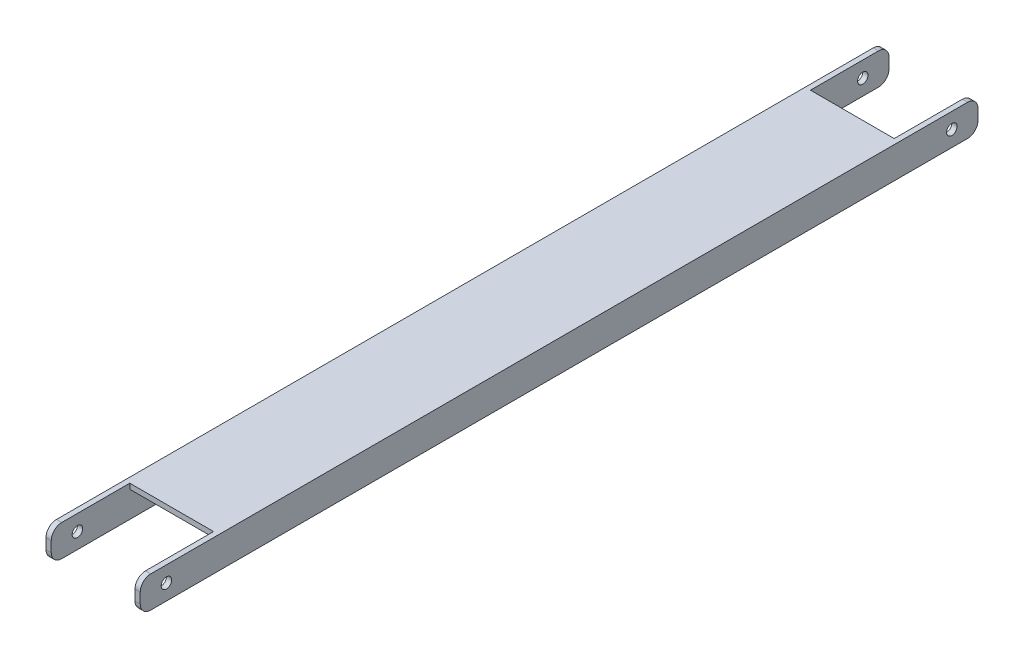
ISO-10303-21;
HEADER;
FILE_DESCRIPTION(('STEP AP214'),'2;1');
FILE_NAME('part.step','',(''),(''),'','','');
FILE_SCHEMA(('AUTOMOTIVE_DESIGN { 1 0 10303 214 1 1 1 1 }'));
ENDSEC;
DATA;
#1=APPLICATION_CONTEXT('core data for automotive mechanical design processes');
#2=APPLICATION_PROTOCOL_DEFINITION('international standard','automotive_design',2000,#1);
#3=PRODUCT_CONTEXT('',#1,'mechanical');
#4=PRODUCT('Part','Part','',(#3));
#5=PRODUCT_RELATED_PRODUCT_CATEGORY('part','',(#4));
#6=PRODUCT_DEFINITION_FORMATION('','',#4);
#7=PRODUCT_DEFINITION_CONTEXT('part definition',#1,'design');
#8=PRODUCT_DEFINITION('design','',#6,#7);
#9=PRODUCT_DEFINITION_SHAPE('','',#8);
#10=(LENGTH_UNIT() NAMED_UNIT(*) SI_UNIT(.MILLI.,.METRE.));
#11=(NAMED_UNIT(*) PLANE_ANGLE_UNIT() SI_UNIT($,.RADIAN.));
#12=(NAMED_UNIT(*) SI_UNIT($,.STERADIAN.) SOLID_ANGLE_UNIT());
#13=UNCERTAINTY_MEASURE_WITH_UNIT(LENGTH_MEASURE(1.E-05),#10,'distance_accuracy_value','');
#14=(GEOMETRIC_REPRESENTATION_CONTEXT(3) GLOBAL_UNCERTAINTY_ASSIGNED_CONTEXT((#13)) GLOBAL_UNIT_ASSIGNED_CONTEXT((#10,
#11,#12)) REPRESENTATION_CONTEXT('',''));
#15=CARTESIAN_POINT('',(0.,0.,0.));
#16=DIRECTION('',(0.,0.,1.));
#17=DIRECTION('',(1.,0.,0.));
#18=AXIS2_PLACEMENT_3D('',#15,#16,#17);
#19=CARTESIAN_POINT('',(-8.99999999999991,0.,154.999999999999));
#20=DIRECTION('',(1.,0.,0.));
#21=DIRECTION('',(0.,0.,-1.));
#22=AXIS2_PLACEMENT_3D('',#19,#20,#21);
#23=CYLINDRICAL_SURFACE('',#22,1.);
#24=CARTESIAN_POINT('',(-7.99999999999989,0.,154.999999999999));
#25=DIRECTION('',(1.,0.,0.));
#26=DIRECTION('',(0.,0.,-1.));
#27=AXIS2_PLACEMENT_3D('',#24,#25,#26);
#28=CIRCLE('',#27,1.);
#29=CARTESIAN_POINT('',(-7.99999999999989,0.,153.999999999999));
#30=VERTEX_POINT('',#29);
#31=EDGE_CURVE('E304',#30,#30,#28,.T.);
#32=ORIENTED_EDGE('',*,*,#31,.T.);
#33=EDGE_LOOP('',(#32));
#34=FACE_BOUND('',#33,.T.);
#35=CARTESIAN_POINT('',(-8.99999999999991,0.,154.999999999999));
#36=DIRECTION('',(1.,0.,0.));
#37=DIRECTION('',(0.,0.,-1.));
#38=AXIS2_PLACEMENT_3D('',#35,#36,#37);
#39=CIRCLE('',#38,1.);
#40=CARTESIAN_POINT('',(-8.99999999999991,0.,153.999999999999));
#41=VERTEX_POINT('',#40);
#42=EDGE_CURVE('E221',#41,#41,#39,.F.);
#43=ORIENTED_EDGE('',*,*,#42,.T.);
#44=EDGE_LOOP('',(#43));
#45=FACE_BOUND('',#44,.T.);
#46=ADVANCED_FACE('F17',(#34,#45),#23,.F.);
#47=CARTESIAN_POINT('',(-8.99999999999998,-2.77555756156289E-13,4.99999999999998));
#48=DIRECTION('',(1.,0.,0.));
#49=DIRECTION('',(0.,0.,-1.));
#50=AXIS2_PLACEMENT_3D('',#47,#48,#49);
#51=CYLINDRICAL_SURFACE('',#50,0.999999999999992);
#52=CARTESIAN_POINT('',(-7.99999999999997,-2.77541878368481E-13,4.99999999999998));
#53=DIRECTION('',(1.,0.,0.));
#54=DIRECTION('',(0.,0.,-1.));
#55=AXIS2_PLACEMENT_3D('',#52,#53,#54);
#56=CIRCLE('',#55,0.999999999999992);
#57=CARTESIAN_POINT('',(-7.99999999999997,-2.77541878368481E-13,3.99999999999999));
#58=VERTEX_POINT('',#57);
#59=EDGE_CURVE('E301',#58,#58,#56,.T.);
#60=ORIENTED_EDGE('',*,*,#59,.T.);
#61=EDGE_LOOP('',(#60));
#62=FACE_BOUND('',#61,.T.);
#63=CARTESIAN_POINT('',(-8.99999999999998,-2.77555756156289E-13,4.99999999999998));
#64=DIRECTION('',(1.,0.,0.));
#65=DIRECTION('',(0.,0.,-1.));
#66=AXIS2_PLACEMENT_3D('',#63,#64,#65);
#67=CIRCLE('',#66,0.999999999999992);
#68=CARTESIAN_POINT('',(-8.99999999999998,-2.77555756156289E-13,3.99999999999999));
#69=VERTEX_POINT('',#68);
#70=EDGE_CURVE('E164',#69,#69,#67,.F.);
#71=ORIENTED_EDGE('',*,*,#70,.T.);
#72=EDGE_LOOP('',(#71));
#73=FACE_BOUND('',#72,.T.);
#74=ADVANCED_FACE('F626',(#62,#73),#51,.F.);
#75=CARTESIAN_POINT('',(-9.,-1.,2.));
#76=DIRECTION('',(1.,0.,0.));
#77=DIRECTION('',(0.,0.,-1.));
#78=AXIS2_PLACEMENT_3D('',#75,#76,#77);
#79=CYLINDRICAL_SURFACE('',#78,1.99999999999999);
#80=CARTESIAN_POINT('',(-8.,-1.,2.));
#81=DIRECTION('',(1.,0.,0.));
#82=DIRECTION('',(0.,0.,-1.));
#83=AXIS2_PLACEMENT_3D('',#80,#81,#82);
#84=CIRCLE('',#83,1.99999999999999);
#85=CARTESIAN_POINT('',(-8.,-1.,0.));
#86=VERTEX_POINT('',#85);
#87=CARTESIAN_POINT('',(-8.,-3.00000000000012,2.));
#88=VERTEX_POINT('',#87);
#89=EDGE_CURVE('E298',#86,#88,#84,.F.);
#90=ORIENTED_EDGE('',*,*,#89,.T.);
#91=DIRECTION('',(1.,0.,0.));
#92=VECTOR('',#91,1.);
#93=CARTESIAN_POINT('',(-8.99999999999994,-3.00000000000011,2.));
#94=LINE('',#93,#92);
#95=CARTESIAN_POINT('',(-8.99999999999999,-3.00000000000004,2.));
#96=VERTEX_POINT('',#95);
#97=EDGE_CURVE('E251',#88,#96,#94,.F.);
#98=ORIENTED_EDGE('',*,*,#97,.T.);
#99=CARTESIAN_POINT('',(-8.99999999999999,-1.,2.));
#100=DIRECTION('',(1.,0.,0.));
#101=DIRECTION('',(0.,0.,-1.));
#102=AXIS2_PLACEMENT_3D('',#99,#100,#101);
#103=CIRCLE('',#102,1.99999999999999);
#104=CARTESIAN_POINT('',(-8.99999999999998,-1.,0.));
#105=VERTEX_POINT('',#104);
#106=EDGE_CURVE('E311',#96,#105,#103,.T.);
#107=ORIENTED_EDGE('',*,*,#106,.T.);
#108=DIRECTION('',(1.,0.,0.));
#109=VECTOR('',#108,1.);
#110=CARTESIAN_POINT('',(0.,-1.00000000000001,0.));
#111=LINE('',#110,#109);
#112=EDGE_CURVE('E243',#105,#86,#111,.T.);
#113=ORIENTED_EDGE('',*,*,#112,.T.);
#114=EDGE_LOOP('',(#90,#98,#107,#113));
#115=FACE_BOUND('',#114,.T.);
#116=ADVANCED_FACE('F379',(#115),#79,.T.);
#117=CARTESIAN_POINT('',(-8.99999999999994,-3.00000000000009,159.999999999999));
#118=DIRECTION('',(0.,1.,0.));
#119=DIRECTION('',(0.,0.,1.));
#120=AXIS2_PLACEMENT_3D('',#117,#118,#119);
#121=PLANE('',#120);
#122=ORIENTED_EDGE('',*,*,#97,.F.);
#123=DIRECTION('',(0.,0.,1.));
#124=VECTOR('',#123,1.);
#125=CARTESIAN_POINT('',(-7.99999999999999,-3.00000000000013,159.999999999999));
#126=LINE('',#125,#124);
#127=CARTESIAN_POINT('',(-7.99999999999995,-3.00000000000014,157.999999999999));
#128=VERTEX_POINT('',#127);
#129=EDGE_CURVE('E297',#88,#128,#126,.T.);
#130=ORIENTED_EDGE('',*,*,#129,.T.);
#131=DIRECTION('',(-1.,0.,0.));
#132=VECTOR('',#131,1.);
#133=CARTESIAN_POINT('',(0.,-3.00000000000015,157.999999999999));
#134=LINE('',#133,#132);
#135=CARTESIAN_POINT('',(-8.99999999999997,-3.00000000000005,157.999999999999));
#136=VERTEX_POINT('',#135);
#137=EDGE_CURVE('E146',#136,#128,#134,.F.);
#138=ORIENTED_EDGE('',*,*,#137,.F.);
#139=DIRECTION('',(0.,0.,-1.));
#140=VECTOR('',#139,1.);
#141=CARTESIAN_POINT('',(-8.99999999999994,-2.99999999999996,159.999999999999));
#142=LINE('',#141,#140);
#143=EDGE_CURVE('E158',#136,#96,#142,.T.);
#144=ORIENTED_EDGE('',*,*,#143,.T.);
#145=EDGE_LOOP('',(#122,#130,#138,#144));
#146=FACE_BOUND('',#145,.T.);
#147=ADVANCED_FACE('F382',(#146),#121,.F.);
#148=CARTESIAN_POINT('',(0.,-1.00000000000017,157.999999999999));
#149=DIRECTION('',(-1.,0.,0.));
#150=DIRECTION('',(0.,0.,1.));
#151=AXIS2_PLACEMENT_3D('',#148,#149,#150);
#152=CYLINDRICAL_SURFACE('',#151,1.99999999999997);
#153=CARTESIAN_POINT('',(-7.99999999999992,-1.00000000000017,157.999999999999));
#154=DIRECTION('',(-1.,0.,0.));
#155=DIRECTION('',(0.,0.,1.));
#156=AXIS2_PLACEMENT_3D('',#153,#154,#155);
#157=CIRCLE('',#156,1.99999999999997);
#158=CARTESIAN_POINT('',(-7.99999999999995,-1.00000000000008,159.999999999999));
#159=VERTEX_POINT('',#158);
#160=EDGE_CURVE('E140',#128,#159,#157,.T.);
#161=ORIENTED_EDGE('',*,*,#160,.T.);
#162=DIRECTION('',(1.,0.,0.));
#163=VECTOR('',#162,1.);
#164=CARTESIAN_POINT('',(0.,-0.99999999999998,159.999999999999));
#165=LINE('',#164,#163);
#166=CARTESIAN_POINT('',(-8.99999999999997,-1.00000000000008,159.999999999999));
#167=VERTEX_POINT('',#166);
#168=EDGE_CURVE('E20',#167,#159,#165,.T.);
#169=ORIENTED_EDGE('',*,*,#168,.F.);
#170=CARTESIAN_POINT('',(-8.99999999999997,-1.00000000000017,157.999999999999));
#171=DIRECTION('',(-1.,0.,0.));
#172=DIRECTION('',(0.,0.,1.));
#173=AXIS2_PLACEMENT_3D('',#170,#171,#172);
#174=CIRCLE('',#173,1.99999999999997);
#175=EDGE_CURVE('E138',#167,#136,#174,.F.);
#176=ORIENTED_EDGE('',*,*,#175,.T.);
#177=ORIENTED_EDGE('',*,*,#137,.T.);
#178=EDGE_LOOP('',(#161,#169,#176,#177));
#179=FACE_BOUND('',#178,.T.);
#180=ADVANCED_FACE('F137',(#179),#152,.T.);
#181=CARTESIAN_POINT('',(0.,-1.94289029309402E-13,159.999999999999));
#182=DIRECTION('',(0.,0.,1.));
#183=DIRECTION('',(1.,0.,0.));
#184=AXIS2_PLACEMENT_3D('',#181,#182,#183);
#185=PLANE('',#184);
#186=DIRECTION('',(0.,1.,0.));
#187=VECTOR('',#186,1.);
#188=CARTESIAN_POINT('',(-7.99999999999999,-3.00000000000017,159.999999999999));
#189=LINE('',#188,#187);
#190=CARTESIAN_POINT('',(-8.00000000000001,0.999999999999924,159.999999999999));
#191=VERTEX_POINT('',#190);
#192=EDGE_CURVE('E295',#159,#191,#189,.T.);
#193=ORIENTED_EDGE('',*,*,#192,.T.);
#194=DIRECTION('',(1.,0.,0.));
#195=VECTOR('',#194,1.);
#196=CARTESIAN_POINT('',(0.,0.999999999999919,159.999999999999));
#197=LINE('',#196,#195);
#198=CARTESIAN_POINT('',(-8.99999999999989,0.999999999999924,159.999999999999));
#199=VERTEX_POINT('',#198);
#200=EDGE_CURVE('E161',#199,#191,#197,.T.);
#201=ORIENTED_EDGE('',*,*,#200,.F.);
#202=DIRECTION('',(0.,1.,0.));
#203=VECTOR('',#202,1.);
#204=CARTESIAN_POINT('',(-8.99999999999994,-3.00000000000009,159.999999999999));
#205=LINE('',#204,#203);
#206=EDGE_CURVE('E154',#199,#167,#205,.F.);
#207=ORIENTED_EDGE('',*,*,#206,.T.);
#208=ORIENTED_EDGE('',*,*,#168,.T.);
#209=EDGE_LOOP('',(#193,#201,#207,#208));
#210=FACE_BOUND('',#209,.T.);
#211=ADVANCED_FACE('F160',(#210),#185,.T.);
#212=CARTESIAN_POINT('',(0.,0.999999999999931,157.999999999999));
#213=DIRECTION('',(1.,0.,0.));
#214=DIRECTION('',(0.,0.,-1.));
#215=AXIS2_PLACEMENT_3D('',#212,#213,#214);
#216=CYLINDRICAL_SURFACE('',#215,2.);
#217=CARTESIAN_POINT('',(-8.99999999999989,0.99999999999993,157.999999999999));
#218=DIRECTION('',(1.,0.,0.));
#219=DIRECTION('',(0.,0.,-1.));
#220=AXIS2_PLACEMENT_3D('',#217,#218,#219);
#221=CIRCLE('',#220,2.);
#222=CARTESIAN_POINT('',(-8.99999999999989,2.99999999999989,157.999999999999));
#223=VERTEX_POINT('',#222);
#224=EDGE_CURVE('E162',#223,#199,#221,.T.);
#225=ORIENTED_EDGE('',*,*,#224,.T.);
#226=ORIENTED_EDGE('',*,*,#200,.T.);
#227=CARTESIAN_POINT('',(-8.00000000000001,0.99999999999993,157.999999999999));
#228=DIRECTION('',(1.,0.,0.));
#229=DIRECTION('',(0.,0.,-1.));
#230=AXIS2_PLACEMENT_3D('',#227,#228,#229);
#231=CIRCLE('',#230,2.);
#232=CARTESIAN_POINT('',(-8.00000000000001,2.99999999999989,157.999999999999));
#233=VERTEX_POINT('',#232);
#234=EDGE_CURVE('E183',#191,#233,#231,.F.);
#235=ORIENTED_EDGE('',*,*,#234,.T.);
#236=DIRECTION('',(1.,0.,0.));
#237=VECTOR('',#236,1.);
#238=CARTESIAN_POINT('',(0.,2.99999999999993,157.999999999999));
#239=LINE('',#238,#237);
#240=EDGE_CURVE('E145',#233,#223,#239,.F.);
#241=ORIENTED_EDGE('',*,*,#240,.T.);
#242=EDGE_LOOP('',(#225,#226,#235,#241));
#243=FACE_BOUND('',#242,.T.);
#244=ADVANCED_FACE('F391',(#243),#216,.T.);
#245=CARTESIAN_POINT('',(8.99999999999999,1.,2.00000000000001));
#246=DIRECTION('',(-1.,0.,0.));
#247=DIRECTION('',(0.,0.,1.));
#248=AXIS2_PLACEMENT_3D('',#245,#246,#247);
#249=CYLINDRICAL_SURFACE('',#248,2.);
#250=CARTESIAN_POINT('',(-8.99999999999997,0.999999999999998,2.));
#251=DIRECTION('',(-1.,0.,0.));
#252=DIRECTION('',(0.,0.,1.));
#253=AXIS2_PLACEMENT_3D('',#250,#251,#252);
#254=CIRCLE('',#253,2.);
#255=CARTESIAN_POINT('',(-8.99999999999996,0.999999999999861,0.));
#256=VERTEX_POINT('',#255);
#257=CARTESIAN_POINT('',(-8.99999999999997,2.99999999999993,2.));
#258=VERTEX_POINT('',#257);
#259=EDGE_CURVE('E307',#256,#258,#254,.F.);
#260=ORIENTED_EDGE('',*,*,#259,.T.);
#261=DIRECTION('',(-1.,0.,0.));
#262=VECTOR('',#261,1.);
#263=CARTESIAN_POINT('',(8.99999999999999,3.,2.00000000000001));
#264=LINE('',#263,#262);
#265=CARTESIAN_POINT('',(-8.,2.99999999999993,2.));
#266=VERTEX_POINT('',#265);
#267=EDGE_CURVE('E246',#258,#266,#264,.F.);
#268=ORIENTED_EDGE('',*,*,#267,.T.);
#269=CARTESIAN_POINT('',(-8.,0.999999999999998,2.));
#270=DIRECTION('',(-1.,0.,0.));
#271=DIRECTION('',(0.,0.,1.));
#272=AXIS2_PLACEMENT_3D('',#269,#270,#271);
#273=CIRCLE('',#272,2.);
#274=CARTESIAN_POINT('',(-8.,0.999999999999861,0.));
#275=VERTEX_POINT('',#274);
#276=EDGE_CURVE('E238',#266,#275,#273,.T.);
#277=ORIENTED_EDGE('',*,*,#276,.T.);
#278=DIRECTION('',(1.,0.,0.));
#279=VECTOR('',#278,1.);
#280=CARTESIAN_POINT('',(0.,0.999999999999723,0.));
#281=LINE('',#280,#279);
#282=EDGE_CURVE('E241',#275,#256,#281,.F.);
#283=ORIENTED_EDGE('',*,*,#282,.T.);
#284=EDGE_LOOP('',(#260,#268,#277,#283));
#285=FACE_BOUND('',#284,.T.);
#286=ADVANCED_FACE('F398',(#285),#249,.T.);
#287=CARTESIAN_POINT('',(0.,0.,0.));
#288=DIRECTION('',(0.,0.,1.));
#289=DIRECTION('',(1.,0.,0.));
#290=AXIS2_PLACEMENT_3D('',#287,#288,#289);
#291=PLANE('',#290);
#292=ORIENTED_EDGE('',*,*,#282,.F.);
#293=DIRECTION('',(0.,1.,0.));
#294=VECTOR('',#293,1.);
#295=CARTESIAN_POINT('',(-8.,-3.00000000000017,0.));
#296=LINE('',#295,#294);
#297=EDGE_CURVE('E233',#275,#86,#296,.F.);
#298=ORIENTED_EDGE('',*,*,#297,.T.);
#299=ORIENTED_EDGE('',*,*,#112,.F.);
#300=DIRECTION('',(0.,1.,0.));
#301=VECTOR('',#300,1.);
#302=CARTESIAN_POINT('',(-8.99999999999996,-3.00000000000009,0.));
#303=LINE('',#302,#301);
#304=EDGE_CURVE('E310',#105,#256,#303,.T.);
#305=ORIENTED_EDGE('',*,*,#304,.T.);
#306=EDGE_LOOP('',(#292,#298,#299,#305));
#307=FACE_BOUND('',#306,.T.);
#308=ADVANCED_FACE('F376',(#307),#291,.F.);
#309=CARTESIAN_POINT('',(7.99999999999994,2.00000000000011,159.999999999999));
#310=DIRECTION('',(0.,1.,0.));
#311=DIRECTION('',(0.,0.,1.));
#312=AXIS2_PLACEMENT_3D('',#309,#310,#311);
#313=PLANE('',#312);
#314=DIRECTION('',(-1.,0.,0.));
#315=VECTOR('',#314,1.);
#316=CARTESIAN_POINT('',(-7.9999999999999,2.00000000000011,144.999999999999));
#317=LINE('',#316,#315);
#318=CARTESIAN_POINT('',(7.99999999999999,2.00000000000003,144.999999999999));
#319=VERTEX_POINT('',#318);
#320=CARTESIAN_POINT('',(-7.99999999999994,2.00000000000004,144.999999999999));
#321=VERTEX_POINT('',#320);
#322=EDGE_CURVE('E205',#319,#321,#317,.T.);
#323=ORIENTED_EDGE('',*,*,#322,.T.);
#324=DIRECTION('',(0.,0.,1.));
#325=VECTOR('',#324,1.);
#326=CARTESIAN_POINT('',(-7.99999999999999,2.,159.999999999999));
#327=LINE('',#326,#325);
#328=CARTESIAN_POINT('',(-7.99999999999995,1.99999999999982,15.));
#329=VERTEX_POINT('',#328);
#330=EDGE_CURVE('E182',#321,#329,#327,.F.);
#331=ORIENTED_EDGE('',*,*,#330,.T.);
#332=DIRECTION('',(1.,0.,0.));
#333=VECTOR('',#332,1.);
#334=CARTESIAN_POINT('',(-7.99999999999999,1.99999999999972,15.));
#335=LINE('',#334,#333);
#336=CARTESIAN_POINT('',(7.99999999999999,1.9999999999999,15.));
#337=VERTEX_POINT('',#336);
#338=EDGE_CURVE('E229',#329,#337,#335,.T.);
#339=ORIENTED_EDGE('',*,*,#338,.T.);
#340=DIRECTION('',(0.,0.,-1.));
#341=VECTOR('',#340,1.);
#342=CARTESIAN_POINT('',(7.99999999999999,1.99999999999999,159.999999999999));
#343=LINE('',#342,#341);
#344=EDGE_CURVE('E200',#337,#319,#343,.F.);
#345=ORIENTED_EDGE('',*,*,#344,.T.);
#346=EDGE_LOOP('',(#323,#331,#339,#345));
#347=FACE_BOUND('',#346,.T.);
#348=ADVANCED_FACE('F424',(#347),#313,.F.);
#349=CARTESIAN_POINT('',(-8.99999999999991,0.,154.999999999999));
#350=DIRECTION('',(1.,0.,0.));
#351=DIRECTION('',(0.,0.,-1.));
#352=AXIS2_PLACEMENT_3D('',#349,#350,#351);
#353=CYLINDRICAL_SURFACE('',#352,1.);
#354=CARTESIAN_POINT('',(7.99999999999997,0.,154.999999999999));
#355=DIRECTION('',(1.,0.,0.));
#356=DIRECTION('',(0.,0.,-1.));
#357=AXIS2_PLACEMENT_3D('',#354,#355,#356);
#358=CIRCLE('',#357,1.);
#359=CARTESIAN_POINT('',(7.99999999999997,0.,153.999999999999));
#360=VERTEX_POINT('',#359);
#361=EDGE_CURVE('E288',#360,#360,#358,.F.);
#362=ORIENTED_EDGE('',*,*,#361,.T.);
#363=EDGE_LOOP('',(#362));
#364=FACE_BOUND('',#363,.T.);
#365=CARTESIAN_POINT('',(8.99999999999997,0.,154.999999999999));
#366=DIRECTION('',(1.,0.,0.));
#367=DIRECTION('',(0.,0.,-1.));
#368=AXIS2_PLACEMENT_3D('',#365,#366,#367);
#369=CIRCLE('',#368,1.);
#370=CARTESIAN_POINT('',(8.99999999999997,0.,153.999999999999));
#371=VERTEX_POINT('',#370);
#372=EDGE_CURVE('E269',#371,#371,#369,.T.);
#373=ORIENTED_EDGE('',*,*,#372,.T.);
#374=EDGE_LOOP('',(#373));
#375=FACE_BOUND('',#374,.T.);
#376=ADVANCED_FACE('F560',(#364,#375),#353,.F.);
#377=CARTESIAN_POINT('',(-8.99999999999998,-2.77555756156289E-13,4.99999999999998));
#378=DIRECTION('',(1.,0.,0.));
#379=DIRECTION('',(0.,0.,-1.));
#380=AXIS2_PLACEMENT_3D('',#377,#378,#379);
#381=CYLINDRICAL_SURFACE('',#380,0.999999999999992);
#382=CARTESIAN_POINT('',(8.,-2.77319833763556E-13,4.99999999999999));
#383=DIRECTION('',(1.,0.,0.));
#384=DIRECTION('',(0.,0.,-1.));
#385=AXIS2_PLACEMENT_3D('',#382,#383,#384);
#386=CIRCLE('',#385,0.999999999999992);
#387=CARTESIAN_POINT('',(8.,-2.77319833763556E-13,4.));
#388=VERTEX_POINT('',#387);
#389=EDGE_CURVE('E285',#388,#388,#386,.F.);
#390=ORIENTED_EDGE('',*,*,#389,.T.);
#391=EDGE_LOOP('',(#390));
#392=FACE_BOUND('',#391,.T.);
#393=CARTESIAN_POINT('',(9.00000000000001,-2.77305955975748E-13,4.99999999999999));
#394=DIRECTION('',(1.,0.,0.));
#395=DIRECTION('',(0.,0.,-1.));
#396=AXIS2_PLACEMENT_3D('',#393,#394,#395);
#397=CIRCLE('',#396,0.999999999999992);
#398=CARTESIAN_POINT('',(9.00000000000001,-2.77305955975748E-13,4.));
#399=VERTEX_POINT('',#398);
#400=EDGE_CURVE('E266',#399,#399,#397,.T.);
#401=ORIENTED_EDGE('',*,*,#400,.T.);
#402=EDGE_LOOP('',(#401));
#403=FACE_BOUND('',#402,.T.);
#404=ADVANCED_FACE('F552',(#392,#403),#381,.F.);
#405=CARTESIAN_POINT('',(0.,-1.00000000000017,157.999999999999));
#406=DIRECTION('',(-1.,0.,0.));
#407=DIRECTION('',(0.,0.,1.));
#408=AXIS2_PLACEMENT_3D('',#405,#406,#407);
#409=CYLINDRICAL_SURFACE('',#408,1.99999999999997);
#410=CARTESIAN_POINT('',(8.99999999999994,-1.00000000000017,157.999999999999));
#411=DIRECTION('',(-1.,0.,0.));
#412=DIRECTION('',(0.,0.,1.));
#413=AXIS2_PLACEMENT_3D('',#410,#411,#412);
#414=CIRCLE('',#413,1.99999999999997);
#415=CARTESIAN_POINT('',(8.99999999999996,-3.,157.999999999999));
#416=VERTEX_POINT('',#415);
#417=CARTESIAN_POINT('',(8.99999999999996,-1.00000000000012,159.999999999999));
#418=VERTEX_POINT('',#417);
#419=EDGE_CURVE('E263',#416,#418,#414,.T.);
#420=ORIENTED_EDGE('',*,*,#419,.T.);
#421=DIRECTION('',(1.,0.,0.));
#422=VECTOR('',#421,1.);
#423=CARTESIAN_POINT('',(0.,-1.00000000000007,159.999999999999));
#424=LINE('',#423,#422);
#425=CARTESIAN_POINT('',(7.99999999999998,-1.00000000000012,159.999999999999));
#426=VERTEX_POINT('',#425);
#427=EDGE_CURVE('E218',#426,#418,#424,.T.);
#428=ORIENTED_EDGE('',*,*,#427,.F.);
#429=CARTESIAN_POINT('',(7.99999999999997,-1.00000000000017,157.999999999999));
#430=DIRECTION('',(-1.,0.,0.));
#431=DIRECTION('',(0.,0.,1.));
#432=AXIS2_PLACEMENT_3D('',#429,#430,#431);
#433=CIRCLE('',#432,1.99999999999997);
#434=CARTESIAN_POINT('',(7.99999999999998,-3.00000000000001,157.999999999999));
#435=VERTEX_POINT('',#434);
#436=EDGE_CURVE('E277',#426,#435,#433,.F.);
#437=ORIENTED_EDGE('',*,*,#436,.T.);
#438=DIRECTION('',(1.,0.,0.));
#439=VECTOR('',#438,1.);
#440=CARTESIAN_POINT('',(7.99999999999999,-3.00000000000001,157.999999999999));
#441=LINE('',#440,#439);
#442=EDGE_CURVE('E206',#435,#416,#441,.T.);
#443=ORIENTED_EDGE('',*,*,#442,.T.);
#444=EDGE_LOOP('',(#420,#428,#437,#443));
#445=FACE_BOUND('',#444,.T.);
#446=ADVANCED_FACE('F333',(#445),#409,.T.);
#447=CARTESIAN_POINT('',(0.,-1.94289029309402E-13,159.999999999999));
#448=DIRECTION('',(0.,0.,1.));
#449=DIRECTION('',(1.,0.,0.));
#450=AXIS2_PLACEMENT_3D('',#447,#448,#449);
#451=PLANE('',#450);
#452=DIRECTION('',(0.,1.,0.));
#453=VECTOR('',#452,1.);
#454=CARTESIAN_POINT('',(8.99999999999997,-3.00000000000002,159.999999999999));
#455=LINE('',#454,#453);
#456=CARTESIAN_POINT('',(9.,0.999999999999898,159.999999999999));
#457=VERTEX_POINT('',#456);
#458=EDGE_CURVE('E262',#418,#457,#455,.T.);
#459=ORIENTED_EDGE('',*,*,#458,.T.);
#460=DIRECTION('',(1.,0.,0.));
#461=VECTOR('',#460,1.);
#462=CARTESIAN_POINT('',(0.,0.999999999999862,159.999999999999));
#463=LINE('',#462,#461);
#464=CARTESIAN_POINT('',(8.00000000000001,0.999999999999898,159.999999999999));
#465=VERTEX_POINT('',#464);
#466=EDGE_CURVE('E214',#465,#457,#463,.T.);
#467=ORIENTED_EDGE('',*,*,#466,.F.);
#468=DIRECTION('',(0.,1.,0.));
#469=VECTOR('',#468,1.);
#470=CARTESIAN_POINT('',(7.99999999999999,-3.00000000000001,159.999999999999));
#471=LINE('',#470,#469);
#472=EDGE_CURVE('E280',#465,#426,#471,.F.);
#473=ORIENTED_EDGE('',*,*,#472,.T.);
#474=ORIENTED_EDGE('',*,*,#427,.T.);
#475=EDGE_LOOP('',(#459,#467,#473,#474));
#476=FACE_BOUND('',#475,.T.);
#477=ADVANCED_FACE('F322',(#476),#451,.T.);
#478=CARTESIAN_POINT('',(0.,0.999999999999931,157.999999999999));
#479=DIRECTION('',(1.,0.,0.));
#480=DIRECTION('',(0.,0.,-1.));
#481=AXIS2_PLACEMENT_3D('',#478,#479,#480);
#482=CYLINDRICAL_SURFACE('',#481,2.);
#483=CARTESIAN_POINT('',(8.00000000000001,0.999999999999933,157.999999999999));
#484=DIRECTION('',(1.,0.,0.));
#485=DIRECTION('',(0.,0.,-1.));
#486=AXIS2_PLACEMENT_3D('',#483,#484,#485);
#487=CIRCLE('',#486,2.);
#488=CARTESIAN_POINT('',(8.00000000000001,2.99999999999989,157.999999999999));
#489=VERTEX_POINT('',#488);
#490=EDGE_CURVE('E199',#489,#465,#487,.T.);
#491=ORIENTED_EDGE('',*,*,#490,.T.);
#492=ORIENTED_EDGE('',*,*,#466,.T.);
#493=CARTESIAN_POINT('',(9.,0.999999999999933,157.999999999999));
#494=DIRECTION('',(1.,0.,0.));
#495=DIRECTION('',(0.,0.,-1.));
#496=AXIS2_PLACEMENT_3D('',#493,#494,#495);
#497=CIRCLE('',#496,2.);
#498=CARTESIAN_POINT('',(9.,2.99999999999989,157.999999999999));
#499=VERTEX_POINT('',#498);
#500=EDGE_CURVE('E259',#457,#499,#497,.F.);
#501=ORIENTED_EDGE('',*,*,#500,.T.);
#502=DIRECTION('',(1.,0.,0.));
#503=VECTOR('',#502,1.);
#504=CARTESIAN_POINT('',(0.,2.99999999999993,157.999999999999));
#505=LINE('',#504,#503);
#506=EDGE_CURVE('E216',#499,#489,#505,.F.);
#507=ORIENTED_EDGE('',*,*,#506,.T.);
#508=EDGE_LOOP('',(#491,#492,#501,#507));
#509=FACE_BOUND('',#508,.T.);
#510=ADVANCED_FACE('F443',(#509),#482,.T.);
#511=CARTESIAN_POINT('',(8.99999999999999,1.,2.00000000000001));
#512=DIRECTION('',(-1.,0.,0.));
#513=DIRECTION('',(0.,0.,1.));
#514=AXIS2_PLACEMENT_3D('',#511,#512,#513);
#515=CYLINDRICAL_SURFACE('',#514,2.);
#516=CARTESIAN_POINT('',(8.00000000000001,1.,2.00000000000001));
#517=DIRECTION('',(-1.,0.,0.));
#518=DIRECTION('',(0.,0.,1.));
#519=AXIS2_PLACEMENT_3D('',#516,#517,#518);
#520=CIRCLE('',#519,2.);
#521=CARTESIAN_POINT('',(7.99999999999999,1.,0.));
#522=VERTEX_POINT('',#521);
#523=CARTESIAN_POINT('',(8.00000000000001,2.99999999999994,2.00000000000001));
#524=VERTEX_POINT('',#523);
#525=EDGE_CURVE('E283',#522,#524,#520,.F.);
#526=ORIENTED_EDGE('',*,*,#525,.T.);
#527=DIRECTION('',(-1.,0.,0.));
#528=VECTOR('',#527,1.);
#529=CARTESIAN_POINT('',(8.99999999999999,3.,2.00000000000001));
#530=LINE('',#529,#528);
#531=CARTESIAN_POINT('',(9.,2.99999999999994,2.00000000000001));
#532=VERTEX_POINT('',#531);
#533=EDGE_CURVE('E35',#524,#532,#530,.F.);
#534=ORIENTED_EDGE('',*,*,#533,.T.);
#535=CARTESIAN_POINT('',(9.,1.,2.00000000000001));
#536=DIRECTION('',(-1.,0.,0.));
#537=DIRECTION('',(0.,0.,1.));
#538=AXIS2_PLACEMENT_3D('',#535,#536,#537);
#539=CIRCLE('',#538,2.);
#540=CARTESIAN_POINT('',(8.99999999999998,1.,0.));
#541=VERTEX_POINT('',#540);
#542=EDGE_CURVE('E257',#532,#541,#539,.T.);
#543=ORIENTED_EDGE('',*,*,#542,.T.);
#544=DIRECTION('',(1.,0.,0.));
#545=VECTOR('',#544,1.);
#546=CARTESIAN_POINT('',(0.,1.,0.));
#547=LINE('',#546,#545);
#548=EDGE_CURVE('E210',#541,#522,#547,.F.);
#549=ORIENTED_EDGE('',*,*,#548,.T.);
#550=EDGE_LOOP('',(#526,#534,#543,#549));
#551=FACE_BOUND('',#550,.T.);
#552=ADVANCED_FACE('F428',(#551),#515,.T.);
#553=CARTESIAN_POINT('',(0.,0.,0.));
#554=DIRECTION('',(0.,0.,1.));
#555=DIRECTION('',(1.,0.,0.));
#556=AXIS2_PLACEMENT_3D('',#553,#554,#555);
#557=PLANE('',#556);
#558=DIRECTION('',(1.,0.,0.));
#559=VECTOR('',#558,1.);
#560=CARTESIAN_POINT('',(0.,-0.99999999999973,0.));
#561=LINE('',#560,#559);
#562=CARTESIAN_POINT('',(7.99999999999998,-0.999999999999869,0.));
#563=VERTEX_POINT('',#562);
#564=CARTESIAN_POINT('',(8.99999999999998,-0.999999999999869,0.));
#565=VERTEX_POINT('',#564);
#566=EDGE_CURVE('E209',#563,#565,#561,.T.);
#567=ORIENTED_EDGE('',*,*,#566,.F.);
#568=DIRECTION('',(0.,1.,0.));
#569=VECTOR('',#568,1.);
#570=CARTESIAN_POINT('',(7.99999999999997,-3.00000000000001,0.));
#571=LINE('',#570,#569);
#572=EDGE_CURVE('E272',#563,#522,#571,.T.);
#573=ORIENTED_EDGE('',*,*,#572,.T.);
#574=ORIENTED_EDGE('',*,*,#548,.F.);
#575=DIRECTION('',(0.,1.,0.));
#576=VECTOR('',#575,1.);
#577=CARTESIAN_POINT('',(8.99999999999996,-3.00000000000002,0.));
#578=LINE('',#577,#576);
#579=EDGE_CURVE('E256',#541,#565,#578,.F.);
#580=ORIENTED_EDGE('',*,*,#579,.T.);
#581=EDGE_LOOP('',(#567,#573,#574,#580));
#582=FACE_BOUND('',#581,.T.);
#583=ADVANCED_FACE('F434',(#582),#557,.F.);
#584=CARTESIAN_POINT('',(7.99999999999999,-1.00000000000001,2.));
#585=DIRECTION('',(1.,0.,0.));
#586=DIRECTION('',(0.,0.,-1.));
#587=AXIS2_PLACEMENT_3D('',#584,#585,#586);
#588=CYLINDRICAL_SURFACE('',#587,1.99999999999999);
#589=CARTESIAN_POINT('',(9.,-1.00000000000001,2.));
#590=DIRECTION('',(1.,0.,0.));
#591=DIRECTION('',(0.,0.,-1.));
#592=AXIS2_PLACEMENT_3D('',#589,#590,#591);
#593=CIRCLE('',#592,1.99999999999999);
#594=CARTESIAN_POINT('',(8.99999999999998,-3.00000000000001,2.));
#595=VERTEX_POINT('',#594);
#596=EDGE_CURVE('E253',#565,#595,#593,.F.);
#597=ORIENTED_EDGE('',*,*,#596,.T.);
#598=DIRECTION('',(1.,0.,0.));
#599=VECTOR('',#598,1.);
#600=CARTESIAN_POINT('',(7.99999999999999,-3.00000000000003,2.));
#601=LINE('',#600,#599);
#602=CARTESIAN_POINT('',(7.99999999999998,-3.00000000000002,2.));
#603=VERTEX_POINT('',#602);
#604=EDGE_CURVE('E203',#595,#603,#601,.F.);
#605=ORIENTED_EDGE('',*,*,#604,.T.);
#606=CARTESIAN_POINT('',(7.99999999999999,-1.00000000000001,2.));
#607=DIRECTION('',(1.,0.,0.));
#608=DIRECTION('',(0.,0.,-1.));
#609=AXIS2_PLACEMENT_3D('',#606,#607,#608);
#610=CIRCLE('',#609,1.99999999999999);
#611=EDGE_CURVE('E273',#603,#563,#610,.T.);
#612=ORIENTED_EDGE('',*,*,#611,.T.);
#613=ORIENTED_EDGE('',*,*,#566,.T.);
#614=EDGE_LOOP('',(#597,#605,#612,#613));
#615=FACE_BOUND('',#614,.T.);
#616=ADVANCED_FACE('F432',(#615),#588,.T.);
#617=CARTESIAN_POINT('',(7.99999999999999,-3.00000000000001,159.999999999999));
#618=DIRECTION('',(0.,1.,0.));
#619=DIRECTION('',(0.,0.,1.));
#620=AXIS2_PLACEMENT_3D('',#617,#618,#619);
#621=PLANE('',#620);
#622=ORIENTED_EDGE('',*,*,#604,.F.);
#623=DIRECTION('',(0.,0.,1.));
#624=VECTOR('',#623,1.);
#625=CARTESIAN_POINT('',(8.99999999999997,-3.,159.999999999999));
#626=LINE('',#625,#624);
#627=EDGE_CURVE('E193',#595,#416,#626,.T.);
#628=ORIENTED_EDGE('',*,*,#627,.T.);
#629=ORIENTED_EDGE('',*,*,#442,.F.);
#630=DIRECTION('',(0.,0.,-1.));
#631=VECTOR('',#630,1.);
#632=CARTESIAN_POINT('',(7.99999999999999,-3.00000000000002,159.999999999999));
#633=LINE('',#632,#631);
#634=EDGE_CURVE('E276',#435,#603,#633,.T.);
#635=ORIENTED_EDGE('',*,*,#634,.T.);
#636=EDGE_LOOP('',(#622,#628,#629,#635));
#637=FACE_BOUND('',#636,.T.);
#638=ADVANCED_FACE('F339',(#637),#621,.F.);
#639=CARTESIAN_POINT('',(-7.9999999999999,-3.0000000000002,144.999999999999));
#640=DIRECTION('',(0.,0.,-1.));
#641=DIRECTION('',(-1.,0.,0.));
#642=AXIS2_PLACEMENT_3D('',#639,#640,#641);
#643=PLANE('',#642);
#644=DIRECTION('',(1.,0.,0.));
#645=VECTOR('',#644,1.);
#646=CARTESIAN_POINT('',(8.99999999999997,2.99999999999985,144.999999999999));
#647=LINE('',#646,#645);
#648=CARTESIAN_POINT('',(8.00000000000001,2.99999999999986,144.999999999999));
#649=VERTEX_POINT('',#648);
#650=CARTESIAN_POINT('',(-7.99999999999996,2.99999999999985,144.999999999999));
#651=VERTEX_POINT('',#650);
#652=EDGE_CURVE('E176',#649,#651,#647,.F.);
#653=ORIENTED_EDGE('',*,*,#652,.T.);
#654=DIRECTION('',(0.,1.,0.));
#655=VECTOR('',#654,1.);
#656=CARTESIAN_POINT('',(-7.99999999999999,-3.00000000000017,144.999999999999));
#657=LINE('',#656,#655);
#658=EDGE_CURVE('E179',#651,#321,#657,.F.);
#659=ORIENTED_EDGE('',*,*,#658,.T.);
#660=ORIENTED_EDGE('',*,*,#322,.F.);
#661=DIRECTION('',(0.,1.,0.));
#662=VECTOR('',#661,1.);
#663=CARTESIAN_POINT('',(7.99999999999998,-3.00000000000001,144.999999999999));
#664=LINE('',#663,#662);
#665=EDGE_CURVE('E196',#319,#649,#664,.T.);
#666=ORIENTED_EDGE('',*,*,#665,.T.);
#667=EDGE_LOOP('',(#653,#659,#660,#666));
#668=FACE_BOUND('',#667,.T.);
#669=ADVANCED_FACE('F414',(#668),#643,.F.);
#670=CARTESIAN_POINT('',(-8.99999999999994,-3.00000000000009,159.999999999999));
#671=DIRECTION('',(1.,0.,0.));
#672=DIRECTION('',(0.,0.,-1.));
#673=AXIS2_PLACEMENT_3D('',#670,#671,#672);
#674=PLANE('',#673);
#675=ORIENTED_EDGE('',*,*,#259,.F.);
#676=ORIENTED_EDGE('',*,*,#304,.F.);
#677=ORIENTED_EDGE('',*,*,#106,.F.);
#678=ORIENTED_EDGE('',*,*,#143,.F.);
#679=ORIENTED_EDGE('',*,*,#175,.F.);
#680=ORIENTED_EDGE('',*,*,#206,.F.);
#681=ORIENTED_EDGE('',*,*,#224,.F.);
#682=DIRECTION('',(0.,0.,1.));
#683=VECTOR('',#682,1.);
#684=CARTESIAN_POINT('',(-8.99999999999989,2.99999999999985,159.999999999999));
#685=LINE('',#684,#683);
#686=EDGE_CURVE('E169',#223,#258,#685,.F.);
#687=ORIENTED_EDGE('',*,*,#686,.T.);
#688=EDGE_LOOP('',(#675,#676,#677,#678,#679,#680,#681,#687));
#689=FACE_BOUND('',#688,.T.);
#690=ORIENTED_EDGE('',*,*,#70,.F.);
#691=EDGE_LOOP('',(#690));
#692=FACE_BOUND('',#691,.T.);
#693=ORIENTED_EDGE('',*,*,#42,.F.);
#694=EDGE_LOOP('',(#693));
#695=FACE_BOUND('',#694,.T.);
#696=ADVANCED_FACE('F151',(#689,#692,#695),#674,.F.);
#697=CARTESIAN_POINT('',(-7.99999999999999,-3.00000000000017,159.999999999999));
#698=DIRECTION('',(-1.,0.,0.));
#699=DIRECTION('',(0.,0.,1.));
#700=AXIS2_PLACEMENT_3D('',#697,#698,#699);
#701=PLANE('',#700);
#702=ORIENTED_EDGE('',*,*,#276,.F.);
#703=DIRECTION('',(0.,0.,1.));
#704=VECTOR('',#703,1.);
#705=CARTESIAN_POINT('',(-8.,2.99999999999985,159.999999999999));
#706=LINE('',#705,#704);
#707=CARTESIAN_POINT('',(-7.99999999999997,2.99999999999987,15.));
#708=VERTEX_POINT('',#707);
#709=EDGE_CURVE('E172',#266,#708,#706,.T.);
#710=ORIENTED_EDGE('',*,*,#709,.T.);
#711=DIRECTION('',(0.,1.,0.));
#712=VECTOR('',#711,1.);
#713=CARTESIAN_POINT('',(-7.99999999999992,-3.,15.));
#714=LINE('',#713,#712);
#715=EDGE_CURVE('E232',#708,#329,#714,.F.);
#716=ORIENTED_EDGE('',*,*,#715,.T.);
#717=ORIENTED_EDGE('',*,*,#330,.F.);
#718=ORIENTED_EDGE('',*,*,#658,.F.);
#719=DIRECTION('',(0.,0.,1.));
#720=VECTOR('',#719,1.);
#721=CARTESIAN_POINT('',(-7.99999999999995,2.99999999999985,159.999999999999));
#722=LINE('',#721,#720);
#723=EDGE_CURVE('E173',#651,#233,#722,.T.);
#724=ORIENTED_EDGE('',*,*,#723,.T.);
#725=ORIENTED_EDGE('',*,*,#234,.F.);
#726=ORIENTED_EDGE('',*,*,#192,.F.);
#727=ORIENTED_EDGE('',*,*,#160,.F.);
#728=ORIENTED_EDGE('',*,*,#129,.F.);
#729=ORIENTED_EDGE('',*,*,#89,.F.);
#730=ORIENTED_EDGE('',*,*,#297,.F.);
#731=EDGE_LOOP('',(#702,#710,#716,#717,#718,#724,#725,#726,#727,#728,#729,#730));
#732=FACE_BOUND('',#731,.T.);
#733=ORIENTED_EDGE('',*,*,#59,.F.);
#734=EDGE_LOOP('',(#733));
#735=FACE_BOUND('',#734,.T.);
#736=ORIENTED_EDGE('',*,*,#31,.F.);
#737=EDGE_LOOP('',(#736));
#738=FACE_BOUND('',#737,.T.);
#739=ADVANCED_FACE('F385',(#732,#735,#738),#701,.F.);
#740=CARTESIAN_POINT('',(-7.99999999999999,-3.,15.));
#741=DIRECTION('',(0.,0.,1.));
#742=DIRECTION('',(1.,0.,0.));
#743=AXIS2_PLACEMENT_3D('',#740,#741,#742);
#744=PLANE('',#743);
#745=DIRECTION('',(1.,0.,0.));
#746=VECTOR('',#745,1.);
#747=CARTESIAN_POINT('',(8.99999999999997,2.99999999999987,15.));
#748=LINE('',#747,#746);
#749=CARTESIAN_POINT('',(7.99999999999999,2.99999999999987,15.));
#750=VERTEX_POINT('',#749);
#751=EDGE_CURVE('E350',#708,#750,#748,.T.);
#752=ORIENTED_EDGE('',*,*,#751,.T.);
#753=DIRECTION('',(0.,1.,0.));
#754=VECTOR('',#753,1.);
#755=CARTESIAN_POINT('',(7.99999999999997,-3.00000000000001,15.));
#756=LINE('',#755,#754);
#757=EDGE_CURVE('E226',#750,#337,#756,.F.);
#758=ORIENTED_EDGE('',*,*,#757,.T.);
#759=ORIENTED_EDGE('',*,*,#338,.F.);
#760=ORIENTED_EDGE('',*,*,#715,.F.);
#761=EDGE_LOOP('',(#752,#758,#759,#760));
#762=FACE_BOUND('',#761,.T.);
#763=ADVANCED_FACE('F425',(#762),#744,.F.);
#764=CARTESIAN_POINT('',(7.99999999999999,-3.00000000000001,159.999999999999));
#765=DIRECTION('',(1.,0.,0.));
#766=DIRECTION('',(0.,0.,-1.));
#767=AXIS2_PLACEMENT_3D('',#764,#765,#766);
#768=PLANE('',#767);
#769=ORIENTED_EDGE('',*,*,#611,.F.);
#770=ORIENTED_EDGE('',*,*,#634,.F.);
#771=ORIENTED_EDGE('',*,*,#436,.F.);
#772=ORIENTED_EDGE('',*,*,#472,.F.);
#773=ORIENTED_EDGE('',*,*,#490,.F.);
#774=DIRECTION('',(0.,0.,1.));
#775=VECTOR('',#774,1.);
#776=CARTESIAN_POINT('',(8.00000000000001,2.99999999999985,159.999999999999));
#777=LINE('',#776,#775);
#778=EDGE_CURVE('E188',#489,#649,#777,.F.);
#779=ORIENTED_EDGE('',*,*,#778,.T.);
#780=ORIENTED_EDGE('',*,*,#665,.F.);
#781=ORIENTED_EDGE('',*,*,#344,.F.);
#782=ORIENTED_EDGE('',*,*,#757,.F.);
#783=DIRECTION('',(0.,0.,1.));
#784=VECTOR('',#783,1.);
#785=CARTESIAN_POINT('',(8.,2.99999999999985,159.999999999999));
#786=LINE('',#785,#784);
#787=EDGE_CURVE('E26',#750,#524,#786,.F.);
#788=ORIENTED_EDGE('',*,*,#787,.T.);
#789=ORIENTED_EDGE('',*,*,#525,.F.);
#790=ORIENTED_EDGE('',*,*,#572,.F.);
#791=EDGE_LOOP('',(#769,#770,#771,#772,#773,#779,#780,#781,#782,#788,#789,#790));
#792=FACE_BOUND('',#791,.T.);
#793=ORIENTED_EDGE('',*,*,#389,.F.);
#794=EDGE_LOOP('',(#793));
#795=FACE_BOUND('',#794,.T.);
#796=ORIENTED_EDGE('',*,*,#361,.F.);
#797=EDGE_LOOP('',(#796));
#798=FACE_BOUND('',#797,.T.);
#799=ADVANCED_FACE('F420',(#792,#795,#798),#768,.F.);
#800=CARTESIAN_POINT('',(8.99999999999997,-3.00000000000002,159.999999999999));
#801=DIRECTION('',(-1.,0.,0.));
#802=DIRECTION('',(0.,0.,1.));
#803=AXIS2_PLACEMENT_3D('',#800,#801,#802);
#804=PLANE('',#803);
#805=ORIENTED_EDGE('',*,*,#596,.F.);
#806=ORIENTED_EDGE('',*,*,#579,.F.);
#807=ORIENTED_EDGE('',*,*,#542,.F.);
#808=DIRECTION('',(0.,0.,1.));
#809=VECTOR('',#808,1.);
#810=CARTESIAN_POINT('',(9.,2.99999999999985,159.999999999999));
#811=LINE('',#810,#809);
#812=EDGE_CURVE('E11',#532,#499,#811,.T.);
#813=ORIENTED_EDGE('',*,*,#812,.T.);
#814=ORIENTED_EDGE('',*,*,#500,.F.);
#815=ORIENTED_EDGE('',*,*,#458,.F.);
#816=ORIENTED_EDGE('',*,*,#419,.F.);
#817=ORIENTED_EDGE('',*,*,#627,.F.);
#818=EDGE_LOOP('',(#805,#806,#807,#813,#814,#815,#816,#817));
#819=FACE_BOUND('',#818,.T.);
#820=ORIENTED_EDGE('',*,*,#400,.F.);
#821=EDGE_LOOP('',(#820));
#822=FACE_BOUND('',#821,.T.);
#823=ORIENTED_EDGE('',*,*,#372,.F.);
#824=EDGE_LOOP('',(#823));
#825=FACE_BOUND('',#824,.T.);
#826=ADVANCED_FACE('F329',(#819,#822,#825),#804,.F.);
#827=CARTESIAN_POINT('',(8.99999999999997,2.99999999999985,159.999999999999));
#828=DIRECTION('',(0.,-1.,0.));
#829=DIRECTION('',(1.,0.,0.));
#830=AXIS2_PLACEMENT_3D('',#827,#828,#829);
#831=PLANE('',#830);
#832=ORIENTED_EDGE('',*,*,#533,.F.);
#833=ORIENTED_EDGE('',*,*,#787,.F.);
#834=ORIENTED_EDGE('',*,*,#751,.F.);
#835=ORIENTED_EDGE('',*,*,#709,.F.);
#836=ORIENTED_EDGE('',*,*,#267,.F.);
#837=ORIENTED_EDGE('',*,*,#686,.F.);
#838=ORIENTED_EDGE('',*,*,#240,.F.);
#839=ORIENTED_EDGE('',*,*,#723,.F.);
#840=ORIENTED_EDGE('',*,*,#652,.F.);
#841=ORIENTED_EDGE('',*,*,#778,.F.);
#842=ORIENTED_EDGE('',*,*,#506,.F.);
#843=ORIENTED_EDGE('',*,*,#812,.F.);
#844=EDGE_LOOP('',(#832,#833,#834,#835,#836,#837,#838,#839,#840,#841,#842,#843));
#845=FACE_BOUND('',#844,.T.);
#846=ADVANCED_FACE('F394',(#845),#831,.F.);
#847=CLOSED_SHELL('',(#46,#74,#116,#147,#180,#211,#244,#286,#308,#348,#376,#404,#446,#477,#510,
#552,#583,#616,#638,#669,#696,#739,#763,#799,#826,#846));
#848=MANIFOLD_SOLID_BREP('B1',#847);
#849=ADVANCED_BREP_SHAPE_REPRESENTATION('',(#18,#848),#14);
#850=SHAPE_DEFINITION_REPRESENTATION(#9,#849);
ENDSEC;
END-ISO-10303-21;
